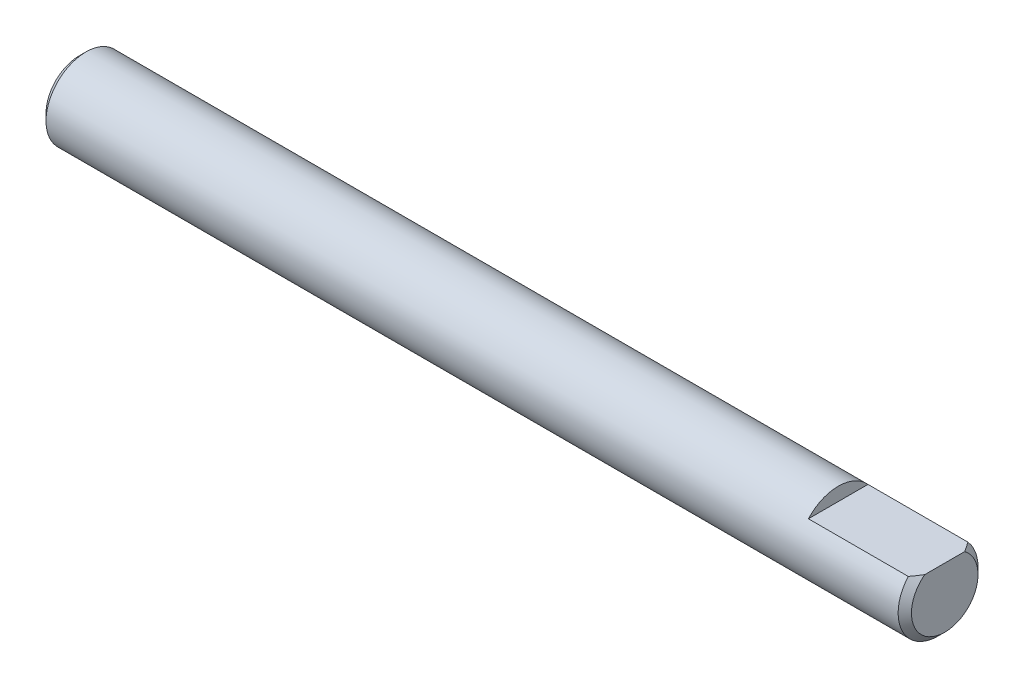
ISO-10303-21;
HEADER;
FILE_DESCRIPTION(('STEP AP214'),'2;1');
FILE_NAME('part.step','',(''),(''),'','','');
FILE_SCHEMA(('AUTOMOTIVE_DESIGN { 1 0 10303 214 1 1 1 1 }'));
ENDSEC;
DATA;
#1=APPLICATION_CONTEXT('core data for automotive mechanical design processes');
#2=APPLICATION_PROTOCOL_DEFINITION('international standard','automotive_design',2000,#1);
#3=PRODUCT_CONTEXT('',#1,'mechanical');
#4=PRODUCT('Part','Part','',(#3));
#5=PRODUCT_RELATED_PRODUCT_CATEGORY('part','',(#4));
#6=PRODUCT_DEFINITION_FORMATION('','',#4);
#7=PRODUCT_DEFINITION_CONTEXT('part definition',#1,'design');
#8=PRODUCT_DEFINITION('design','',#6,#7);
#9=PRODUCT_DEFINITION_SHAPE('','',#8);
#10=(LENGTH_UNIT() NAMED_UNIT(*) SI_UNIT(.MILLI.,.METRE.));
#11=(NAMED_UNIT(*) PLANE_ANGLE_UNIT() SI_UNIT($,.RADIAN.));
#12=(NAMED_UNIT(*) SI_UNIT($,.STERADIAN.) SOLID_ANGLE_UNIT());
#13=UNCERTAINTY_MEASURE_WITH_UNIT(LENGTH_MEASURE(1.E-05),#10,'distance_accuracy_value','');
#14=(GEOMETRIC_REPRESENTATION_CONTEXT(3) GLOBAL_UNCERTAINTY_ASSIGNED_CONTEXT((#13)) GLOBAL_UNIT_ASSIGNED_CONTEXT((#10,
#11,#12)) REPRESENTATION_CONTEXT('',''));
#15=CARTESIAN_POINT('',(0.,0.,0.));
#16=DIRECTION('',(0.,0.,1.));
#17=DIRECTION('',(1.,0.,0.));
#18=AXIS2_PLACEMENT_3D('',#15,#16,#17);
#19=CARTESIAN_POINT('',(32.5,0.,0.));
#20=DIRECTION('',(-1.,0.,0.));
#21=DIRECTION('',(0.,0.,1.));
#22=AXIS2_PLACEMENT_3D('',#19,#20,#21);
#23=CYLINDRICAL_SURFACE('',#22,3.);
#24=CARTESIAN_POINT('',(-32.,0.,0.));
#25=DIRECTION('',(1.,0.,0.));
#26=DIRECTION('',(0.,0.,-1.));
#27=AXIS2_PLACEMENT_3D('',#24,#25,#26);
#28=CIRCLE('',#27,3.);
#29=CARTESIAN_POINT('',(-32.,0.,-3.));
#30=VERTEX_POINT('',#29);
#31=EDGE_CURVE('E92',#30,#30,#28,.T.);
#32=ORIENTED_EDGE('',*,*,#31,.T.);
#33=EDGE_LOOP('',(#32));
#34=FACE_BOUND('',#33,.T.);
#35=DIRECTION('',(1.,0.,0.));
#36=VECTOR('',#35,1.);
#37=CARTESIAN_POINT('',(24.5,2.,-2.23606797749979));
#38=LINE('',#37,#36);
#39=CARTESIAN_POINT('',(24.5,2.,-2.23606797749979));
#40=VERTEX_POINT('',#39);
#41=CARTESIAN_POINT('',(32.,2.,-2.23606797749979));
#42=VERTEX_POINT('',#41);
#43=EDGE_CURVE('E84',#40,#42,#38,.T.);
#44=ORIENTED_EDGE('',*,*,#43,.T.);
#45=CARTESIAN_POINT('',(32.,0.,0.));
#46=DIRECTION('',(1.,0.,0.));
#47=DIRECTION('',(0.,0.,-1.));
#48=AXIS2_PLACEMENT_3D('',#45,#46,#47);
#49=CIRCLE('',#48,3.);
#50=CARTESIAN_POINT('',(32.,2.,2.23606797749979));
#51=VERTEX_POINT('',#50);
#52=EDGE_CURVE('E86',#42,#51,#49,.F.);
#53=ORIENTED_EDGE('',*,*,#52,.T.);
#54=DIRECTION('',(1.,0.,0.));
#55=VECTOR('',#54,1.);
#56=CARTESIAN_POINT('',(24.5,2.,2.23606797749979));
#57=LINE('',#56,#55);
#58=CARTESIAN_POINT('',(24.5,2.,2.23606797749979));
#59=VERTEX_POINT('',#58);
#60=EDGE_CURVE('E83',#59,#51,#57,.T.);
#61=ORIENTED_EDGE('',*,*,#60,.F.);
#62=CARTESIAN_POINT('',(24.5,0.,0.));
#63=DIRECTION('',(1.,0.,0.));
#64=DIRECTION('',(0.,0.,-1.));
#65=AXIS2_PLACEMENT_3D('',#62,#63,#64);
#66=CIRCLE('',#65,3.);
#67=EDGE_CURVE('E73',#40,#59,#66,.T.);
#68=ORIENTED_EDGE('',*,*,#67,.F.);
#69=EDGE_LOOP('',(#44,#53,#61,#68));
#70=FACE_BOUND('',#69,.T.);
#71=ADVANCED_FACE('F33',(#34,#70),#23,.T.);
#72=CARTESIAN_POINT('',(32.5,0.,0.));
#73=DIRECTION('',(1.,0.,0.));
#74=DIRECTION('',(0.,0.,-1.));
#75=AXIS2_PLACEMENT_3D('',#72,#73,#74);
#76=PLANE('',#75);
#77=DIRECTION('',(0.,0.,-1.));
#78=VECTOR('',#77,1.);
#79=CARTESIAN_POINT('',(32.5,2.,2.23606797749979));
#80=LINE('',#79,#78);
#81=CARTESIAN_POINT('',(32.5,2.,1.49999999999997));
#82=VERTEX_POINT('',#81);
#83=CARTESIAN_POINT('',(32.5,2.,-1.49999999999997));
#84=VERTEX_POINT('',#83);
#85=EDGE_CURVE('E80',#82,#84,#80,.T.);
#86=ORIENTED_EDGE('',*,*,#85,.F.);
#87=CARTESIAN_POINT('',(32.5,0.,0.));
#88=DIRECTION('',(1.,0.,0.));
#89=DIRECTION('',(0.,0.,-1.));
#90=AXIS2_PLACEMENT_3D('',#87,#88,#89);
#91=CIRCLE('',#90,2.49999999999998);
#92=EDGE_CURVE('E98',#82,#84,#91,.T.);
#93=ORIENTED_EDGE('',*,*,#92,.T.);
#94=EDGE_LOOP('',(#86,#93));
#95=FACE_BOUND('',#94,.T.);
#96=ADVANCED_FACE('F107',(#95),#76,.T.);
#97=CARTESIAN_POINT('',(-32.5,0.,0.));
#98=DIRECTION('',(1.,0.,0.));
#99=DIRECTION('',(0.,0.,-1.));
#100=AXIS2_PLACEMENT_3D('',#97,#98,#99);
#101=PLANE('',#100);
#102=CARTESIAN_POINT('',(-32.5,0.,0.));
#103=DIRECTION('',(1.,0.,0.));
#104=DIRECTION('',(0.,0.,-1.));
#105=AXIS2_PLACEMENT_3D('',#102,#103,#104);
#106=CIRCLE('',#105,2.50000000000002);
#107=CARTESIAN_POINT('',(-32.5,0.,-2.50000000000002));
#108=VERTEX_POINT('',#107);
#109=EDGE_CURVE('E95',#108,#108,#106,.F.);
#110=ORIENTED_EDGE('',*,*,#109,.T.);
#111=EDGE_LOOP('',(#110));
#112=FACE_BOUND('',#111,.T.);
#113=ADVANCED_FACE('F106',(#112),#101,.F.);
#114=CARTESIAN_POINT('',(24.5,2.,2.23606797749979));
#115=DIRECTION('',(0.,-1.,0.));
#116=DIRECTION('',(0.,0.,-1.));
#117=AXIS2_PLACEMENT_3D('',#114,#115,#116);
#118=PLANE('',#117);
#119=ORIENTED_EDGE('',*,*,#85,.T.);
#120=CARTESIAN_POINT('',(32.5,2.,-1.49999999999997));
#121=CARTESIAN_POINT('',(32.4617993221427,2.,-1.56363441041132));
#122=CARTESIAN_POINT('',(32.4224920359348,2.,-1.62658889898812));
#123=CARTESIAN_POINT('',(32.3420572974233,2.,-1.75127191097623));
#124=CARTESIAN_POINT('',(32.300930975112,2.,-1.81300116191586));
#125=CARTESIAN_POINT('',(32.2172105304513,2.,-1.93543485253752));
#126=CARTESIAN_POINT('',(32.1746166557635,2.,-1.99613946258491));
#127=CARTESIAN_POINT('',(32.0881782263033,2.,-2.11670900846293));
#128=CARTESIAN_POINT('',(32.0443329228987,2.,-2.17657340830976));
#129=CARTESIAN_POINT('',(32.,2.,-2.23606797749979));
#130=B_SPLINE_CURVE_WITH_KNOTS('',3,(#120,#121,#122,#123,#124,#125,#126,#127,#128,#129),
.UNSPECIFIED.,.F.,.F.,(4,2,2,2,4),(0.,0.222629901922151,0.445123396049353,0.667579524717594,
0.890171642368406),.UNSPECIFIED.);
#131=EDGE_CURVE('E11',#84,#42,#130,.T.);
#132=ORIENTED_EDGE('',*,*,#131,.T.);
#133=ORIENTED_EDGE('',*,*,#43,.F.);
#134=DIRECTION('',(0.,0.,-1.));
#135=VECTOR('',#134,1.);
#136=CARTESIAN_POINT('',(24.5,2.,2.23606797749979));
#137=LINE('',#136,#135);
#138=EDGE_CURVE('E76',#59,#40,#137,.T.);
#139=ORIENTED_EDGE('',*,*,#138,.F.);
#140=ORIENTED_EDGE('',*,*,#60,.T.);
#141=CARTESIAN_POINT('',(32.,2.,2.23606797749979));
#142=CARTESIAN_POINT('',(32.0443329228987,2.,2.17657340830977));
#143=CARTESIAN_POINT('',(32.0881782263033,2.,2.11670900846293));
#144=CARTESIAN_POINT('',(32.1746166557635,2.,1.99613946258491));
#145=CARTESIAN_POINT('',(32.2172105304513,2.,1.93543485253752));
#146=CARTESIAN_POINT('',(32.300930975112,2.,1.81300116191586));
#147=CARTESIAN_POINT('',(32.3420572974233,2.,1.75127191097623));
#148=CARTESIAN_POINT('',(32.4224920359348,2.,1.62658889898812));
#149=CARTESIAN_POINT('',(32.4617993221427,2.,1.56363441041132));
#150=CARTESIAN_POINT('',(32.5,2.,1.49999999999997));
#151=B_SPLINE_CURVE_WITH_KNOTS('',3,(#141,#142,#143,#144,#145,#146,#147,#148,#149,#150),
.UNSPECIFIED.,.F.,.F.,(4,2,2,2,4),(0.,0.222592117650813,0.445048246319054,0.667541740446256,
0.890171642368407),.UNSPECIFIED.);
#152=EDGE_CURVE('E46',#51,#82,#151,.T.);
#153=ORIENTED_EDGE('',*,*,#152,.T.);
#154=EDGE_LOOP('',(#119,#132,#133,#139,#140,#153));
#155=FACE_BOUND('',#154,.T.);
#156=ADVANCED_FACE('F82',(#155),#118,.F.);
#157=CARTESIAN_POINT('',(24.5,0.,0.));
#158=DIRECTION('',(1.,0.,0.));
#159=DIRECTION('',(0.,0.,-1.));
#160=AXIS2_PLACEMENT_3D('',#157,#158,#159);
#161=PLANE('',#160);
#162=ORIENTED_EDGE('',*,*,#67,.T.);
#163=ORIENTED_EDGE('',*,*,#138,.T.);
#164=EDGE_LOOP('',(#162,#163));
#165=FACE_BOUND('',#164,.T.);
#166=ADVANCED_FACE('F75',(#165),#161,.T.);
#167=CARTESIAN_POINT('',(-32.,0.,0.));
#168=DIRECTION('',(1.,0.,0.));
#169=DIRECTION('',(0.,0.,-1.));
#170=AXIS2_PLACEMENT_3D('',#167,#168,#169);
#171=CONICAL_SURFACE('',#170,3.,0.785398163397446);
#172=ORIENTED_EDGE('',*,*,#109,.F.);
#173=EDGE_LOOP('',(#172));
#174=FACE_BOUND('',#173,.T.);
#175=ORIENTED_EDGE('',*,*,#31,.F.);
#176=EDGE_LOOP('',(#175));
#177=FACE_BOUND('',#176,.T.);
#178=ADVANCED_FACE('F117',(#174,#177),#171,.T.);
#179=CARTESIAN_POINT('',(32.5,0.,0.));
#180=DIRECTION('',(-1.,0.,0.));
#181=DIRECTION('',(0.,0.,1.));
#182=AXIS2_PLACEMENT_3D('',#179,#180,#181);
#183=CONICAL_SURFACE('',#182,2.49999999999998,0.785398163397453);
#184=ORIENTED_EDGE('',*,*,#152,.F.);
#185=ORIENTED_EDGE('',*,*,#52,.F.);
#186=ORIENTED_EDGE('',*,*,#131,.F.);
#187=ORIENTED_EDGE('',*,*,#92,.F.);
#188=EDGE_LOOP('',(#184,#185,#186,#187));
#189=FACE_BOUND('',#188,.T.);
#190=ADVANCED_FACE('F35',(#189),#183,.T.);
#191=CLOSED_SHELL('',(#71,#96,#113,#156,#166,#178,#190));
#192=MANIFOLD_SOLID_BREP('B2',#191);
#193=ADVANCED_BREP_SHAPE_REPRESENTATION('',(#18,#192),#14);
#194=SHAPE_DEFINITION_REPRESENTATION(#9,#193);
ENDSEC;
END-ISO-10303-21;
